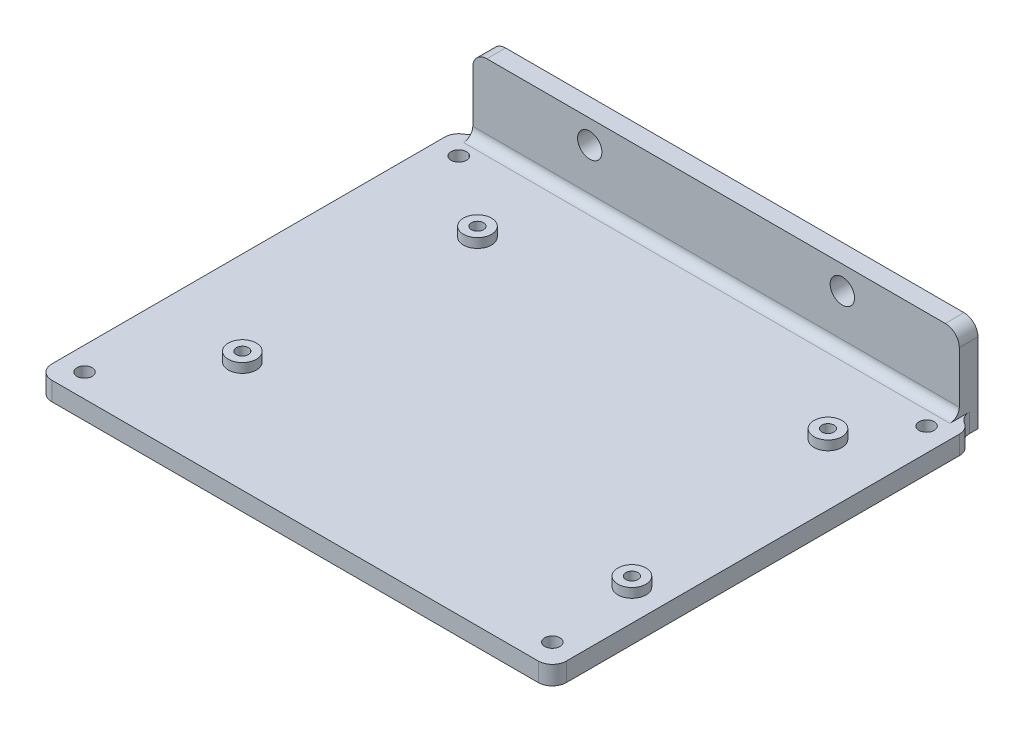
ISO-10303-21;
HEADER;
FILE_DESCRIPTION(('STEP AP214'),'2;1');
FILE_NAME('part.step','',(''),(''),'','','');
FILE_SCHEMA(('AUTOMOTIVE_DESIGN { 1 0 10303 214 1 1 1 1 }'));
ENDSEC;
DATA;
#1=APPLICATION_CONTEXT('core data for automotive mechanical design processes');
#2=APPLICATION_PROTOCOL_DEFINITION('international standard','automotive_design',2000,#1);
#3=PRODUCT_CONTEXT('',#1,'mechanical');
#4=PRODUCT('Part','Part','',(#3));
#5=PRODUCT_RELATED_PRODUCT_CATEGORY('part','',(#4));
#6=PRODUCT_DEFINITION_FORMATION('','',#4);
#7=PRODUCT_DEFINITION_CONTEXT('part definition',#1,'design');
#8=PRODUCT_DEFINITION('design','',#6,#7);
#9=PRODUCT_DEFINITION_SHAPE('','',#8);
#10=(LENGTH_UNIT() NAMED_UNIT(*) SI_UNIT(.MILLI.,.METRE.));
#11=(NAMED_UNIT(*) PLANE_ANGLE_UNIT() SI_UNIT($,.RADIAN.));
#12=(NAMED_UNIT(*) SI_UNIT($,.STERADIAN.) SOLID_ANGLE_UNIT());
#13=UNCERTAINTY_MEASURE_WITH_UNIT(LENGTH_MEASURE(1.E-05),#10,'distance_accuracy_value','');
#14=(GEOMETRIC_REPRESENTATION_CONTEXT(3) GLOBAL_UNCERTAINTY_ASSIGNED_CONTEXT((#13)) GLOBAL_UNIT_ASSIGNED_CONTEXT((#10,
#11,#12)) REPRESENTATION_CONTEXT('',''));
#15=CARTESIAN_POINT('',(0.,0.,0.));
#16=DIRECTION('',(0.,0.,1.));
#17=DIRECTION('',(1.,0.,0.));
#18=AXIS2_PLACEMENT_3D('',#15,#16,#17);
#19=CARTESIAN_POINT('',(3.,4.,-3.));
#20=DIRECTION('',(0.,-1.,0.));
#21=DIRECTION('',(0.,0.,-1.));
#22=AXIS2_PLACEMENT_3D('',#19,#20,#21);
#23=CYLINDRICAL_SURFACE('',#22,3.);
#24=CARTESIAN_POINT('',(3.,0.,-3.));
#25=DIRECTION('',(0.,1.,0.));
#26=DIRECTION('',(0.,0.,1.));
#27=AXIS2_PLACEMENT_3D('',#24,#25,#26);
#28=CIRCLE('',#27,3.);
#29=CARTESIAN_POINT('',(0.,0.,-3.00000000000002));
#30=VERTEX_POINT('',#29);
#31=CARTESIAN_POINT('',(3.00000000000002,0.,0.));
#32=VERTEX_POINT('',#31);
#33=EDGE_CURVE('E259',#30,#32,#28,.T.);
#34=ORIENTED_EDGE('',*,*,#33,.T.);
#35=DIRECTION('',(0.,-1.,0.));
#36=VECTOR('',#35,1.);
#37=CARTESIAN_POINT('',(3.00000000000002,4.,0.));
#38=LINE('',#37,#36);
#39=CARTESIAN_POINT('',(3.00000000000002,4.,0.));
#40=VERTEX_POINT('',#39);
#41=EDGE_CURVE('E328',#40,#32,#38,.T.);
#42=ORIENTED_EDGE('',*,*,#41,.F.);
#43=CARTESIAN_POINT('',(3.,4.,-3.));
#44=DIRECTION('',(0.,1.,0.));
#45=DIRECTION('',(0.,0.,1.));
#46=AXIS2_PLACEMENT_3D('',#43,#44,#45);
#47=CIRCLE('',#46,3.);
#48=CARTESIAN_POINT('',(0.,4.,-3.00000000000002));
#49=VERTEX_POINT('',#48);
#50=EDGE_CURVE('E263',#49,#40,#47,.T.);
#51=ORIENTED_EDGE('',*,*,#50,.F.);
#52=DIRECTION('',(0.,-1.,0.));
#53=VECTOR('',#52,1.);
#54=CARTESIAN_POINT('',(0.,4.,-3.00000000000002));
#55=LINE('',#54,#53);
#56=EDGE_CURVE('E287',#49,#30,#55,.T.);
#57=ORIENTED_EDGE('',*,*,#56,.T.);
#58=EDGE_LOOP('',(#34,#42,#51,#57));
#59=FACE_BOUND('',#58,.T.);
#60=ADVANCED_FACE('F39',(#59),#23,.T.);
#61=CARTESIAN_POINT('',(3.00000000000002,4.,0.));
#62=DIRECTION('',(0.,0.,-1.));
#63=DIRECTION('',(-1.,0.,0.));
#64=AXIS2_PLACEMENT_3D('',#61,#62,#63);
#65=PLANE('',#64);
#66=DIRECTION('',(1.,0.,0.));
#67=VECTOR('',#66,1.);
#68=CARTESIAN_POINT('',(3.00000000000002,0.,0.));
#69=LINE('',#68,#67);
#70=CARTESIAN_POINT('',(107.,0.,0.));
#71=VERTEX_POINT('',#70);
#72=EDGE_CURVE('E291',#32,#71,#69,.T.);
#73=ORIENTED_EDGE('',*,*,#72,.T.);
#74=DIRECTION('',(0.,-1.,0.));
#75=VECTOR('',#74,1.);
#76=CARTESIAN_POINT('',(107.,4.,0.));
#77=LINE('',#76,#75);
#78=CARTESIAN_POINT('',(107.,4.,0.));
#79=VERTEX_POINT('',#78);
#80=EDGE_CURVE('E324',#79,#71,#77,.T.);
#81=ORIENTED_EDGE('',*,*,#80,.F.);
#82=DIRECTION('',(1.,0.,0.));
#83=VECTOR('',#82,1.);
#84=CARTESIAN_POINT('',(3.00000000000002,4.,0.));
#85=LINE('',#84,#83);
#86=EDGE_CURVE('E267',#40,#79,#85,.T.);
#87=ORIENTED_EDGE('',*,*,#86,.F.);
#88=ORIENTED_EDGE('',*,*,#41,.T.);
#89=EDGE_LOOP('',(#73,#81,#87,#88));
#90=FACE_BOUND('',#89,.T.);
#91=ADVANCED_FACE('F485',(#90),#65,.F.);
#92=CARTESIAN_POINT('',(107.,4.,-3.));
#93=DIRECTION('',(0.,-1.,0.));
#94=DIRECTION('',(0.,0.,-1.));
#95=AXIS2_PLACEMENT_3D('',#92,#93,#94);
#96=CYLINDRICAL_SURFACE('',#95,3.);
#97=CARTESIAN_POINT('',(107.,0.,-3.));
#98=DIRECTION('',(0.,1.,0.));
#99=DIRECTION('',(0.,0.,1.));
#100=AXIS2_PLACEMENT_3D('',#97,#98,#99);
#101=CIRCLE('',#100,3.);
#102=CARTESIAN_POINT('',(110.,0.,-3.00000000000002));
#103=VERTEX_POINT('',#102);
#104=EDGE_CURVE('E294',#71,#103,#101,.T.);
#105=ORIENTED_EDGE('',*,*,#104,.T.);
#106=DIRECTION('',(0.,-1.,0.));
#107=VECTOR('',#106,1.);
#108=CARTESIAN_POINT('',(110.,4.,-3.00000000000002));
#109=LINE('',#108,#107);
#110=CARTESIAN_POINT('',(110.,4.,-3.00000000000002));
#111=VERTEX_POINT('',#110);
#112=EDGE_CURVE('E320',#111,#103,#109,.T.);
#113=ORIENTED_EDGE('',*,*,#112,.F.);
#114=CARTESIAN_POINT('',(107.,4.,-3.));
#115=DIRECTION('',(0.,1.,0.));
#116=DIRECTION('',(0.,0.,1.));
#117=AXIS2_PLACEMENT_3D('',#114,#115,#116);
#118=CIRCLE('',#117,3.);
#119=EDGE_CURVE('E271',#79,#111,#118,.T.);
#120=ORIENTED_EDGE('',*,*,#119,.F.);
#121=ORIENTED_EDGE('',*,*,#80,.T.);
#122=EDGE_LOOP('',(#105,#113,#120,#121));
#123=FACE_BOUND('',#122,.T.);
#124=ADVANCED_FACE('F481',(#123),#96,.T.);
#125=CARTESIAN_POINT('',(110.,4.,-3.00000000000002));
#126=DIRECTION('',(-1.,0.,0.));
#127=DIRECTION('',(0.,0.,1.));
#128=AXIS2_PLACEMENT_3D('',#125,#126,#127);
#129=PLANE('',#128);
#130=DIRECTION('',(0.,0.,-1.));
#131=VECTOR('',#130,1.);
#132=CARTESIAN_POINT('',(110.,0.,-3.00000000000002));
#133=LINE('',#132,#131);
#134=CARTESIAN_POINT('',(110.,0.,-87.));
#135=VERTEX_POINT('',#134);
#136=EDGE_CURVE('E297',#103,#135,#133,.T.);
#137=ORIENTED_EDGE('',*,*,#136,.T.);
#138=DIRECTION('',(0.,-1.,0.));
#139=VECTOR('',#138,1.);
#140=CARTESIAN_POINT('',(110.,4.,-87.));
#141=LINE('',#140,#139);
#142=CARTESIAN_POINT('',(110.,4.,-87.));
#143=VERTEX_POINT('',#142);
#144=EDGE_CURVE('E316',#143,#135,#141,.T.);
#145=ORIENTED_EDGE('',*,*,#144,.F.);
#146=DIRECTION('',(0.,0.,-1.));
#147=VECTOR('',#146,1.);
#148=CARTESIAN_POINT('',(110.,4.,-3.00000000000002));
#149=LINE('',#148,#147);
#150=EDGE_CURVE('E274',#111,#143,#149,.T.);
#151=ORIENTED_EDGE('',*,*,#150,.F.);
#152=ORIENTED_EDGE('',*,*,#112,.T.);
#153=EDGE_LOOP('',(#137,#145,#151,#152));
#154=FACE_BOUND('',#153,.T.);
#155=ADVANCED_FACE('F477',(#154),#129,.F.);
#156=CARTESIAN_POINT('',(107.,4.,-87.));
#157=DIRECTION('',(0.,-1.,0.));
#158=DIRECTION('',(0.,0.,-1.));
#159=AXIS2_PLACEMENT_3D('',#156,#157,#158);
#160=CYLINDRICAL_SURFACE('',#159,3.);
#161=CARTESIAN_POINT('',(107.,0.,-87.));
#162=DIRECTION('',(0.,1.,0.));
#163=DIRECTION('',(0.,0.,1.));
#164=AXIS2_PLACEMENT_3D('',#161,#162,#163);
#165=CIRCLE('',#164,3.);
#166=CARTESIAN_POINT('',(108.5,0.,-89.5980762113533));
#167=VERTEX_POINT('',#166);
#168=EDGE_CURVE('E300',#135,#167,#165,.T.);
#169=ORIENTED_EDGE('',*,*,#168,.T.);
#170=DIRECTION('',(0.,-1.,0.));
#171=VECTOR('',#170,1.);
#172=CARTESIAN_POINT('',(108.5,4.,-89.5980762113533));
#173=LINE('',#172,#171);
#174=CARTESIAN_POINT('',(108.5,4.,-89.5980762113533));
#175=VERTEX_POINT('',#174);
#176=EDGE_CURVE('E337',#167,#175,#173,.F.);
#177=ORIENTED_EDGE('',*,*,#176,.T.);
#178=CARTESIAN_POINT('',(107.,4.,-87.));
#179=DIRECTION('',(0.,1.,0.));
#180=DIRECTION('',(0.,0.,1.));
#181=AXIS2_PLACEMENT_3D('',#178,#179,#180);
#182=CIRCLE('',#181,3.);
#183=EDGE_CURVE('E277',#143,#175,#182,.T.);
#184=ORIENTED_EDGE('',*,*,#183,.F.);
#185=ORIENTED_EDGE('',*,*,#144,.T.);
#186=EDGE_LOOP('',(#169,#177,#184,#185));
#187=FACE_BOUND('',#186,.T.);
#188=ADVANCED_FACE('F472',(#187),#160,.T.);
#189=CARTESIAN_POINT('',(3.,4.,-87.));
#190=DIRECTION('',(0.,-1.,0.));
#191=DIRECTION('',(0.,0.,-1.));
#192=AXIS2_PLACEMENT_3D('',#189,#190,#191);
#193=CYLINDRICAL_SURFACE('',#192,3.);
#194=CARTESIAN_POINT('',(3.,4.,-87.));
#195=DIRECTION('',(0.,1.,0.));
#196=DIRECTION('',(0.,0.,1.));
#197=AXIS2_PLACEMENT_3D('',#194,#195,#196);
#198=CIRCLE('',#197,3.);
#199=CARTESIAN_POINT('',(1.5,4.,-89.5980762113533));
#200=VERTEX_POINT('',#199);
#201=CARTESIAN_POINT('',(0.,4.,-87.));
#202=VERTEX_POINT('',#201);
#203=EDGE_CURVE('E281',#200,#202,#198,.T.);
#204=ORIENTED_EDGE('',*,*,#203,.F.);
#205=DIRECTION('',(0.,-1.,0.));
#206=VECTOR('',#205,1.);
#207=CARTESIAN_POINT('',(1.5,4.,-89.5980762113533));
#208=LINE('',#207,#206);
#209=CARTESIAN_POINT('',(1.5,0.,-89.5980762113533));
#210=VERTEX_POINT('',#209);
#211=EDGE_CURVE('E340',#200,#210,#208,.T.);
#212=ORIENTED_EDGE('',*,*,#211,.T.);
#213=CARTESIAN_POINT('',(3.,0.,-87.));
#214=DIRECTION('',(0.,1.,0.));
#215=DIRECTION('',(0.,0.,1.));
#216=AXIS2_PLACEMENT_3D('',#213,#214,#215);
#217=CIRCLE('',#216,3.);
#218=CARTESIAN_POINT('',(0.,0.,-87.));
#219=VERTEX_POINT('',#218);
#220=EDGE_CURVE('E304',#210,#219,#217,.T.);
#221=ORIENTED_EDGE('',*,*,#220,.T.);
#222=DIRECTION('',(0.,-1.,0.));
#223=VECTOR('',#222,1.);
#224=CARTESIAN_POINT('',(0.,4.,-87.));
#225=LINE('',#224,#223);
#226=EDGE_CURVE('E312',#202,#219,#225,.T.);
#227=ORIENTED_EDGE('',*,*,#226,.F.);
#228=EDGE_LOOP('',(#204,#212,#221,#227));
#229=FACE_BOUND('',#228,.T.);
#230=ADVANCED_FACE('F498',(#229),#193,.T.);
#231=CARTESIAN_POINT('',(0.,4.,-3.00000000000002));
#232=DIRECTION('',(1.,0.,0.));
#233=DIRECTION('',(0.,0.,-1.));
#234=AXIS2_PLACEMENT_3D('',#231,#232,#233);
#235=PLANE('',#234);
#236=DIRECTION('',(0.,0.,1.));
#237=VECTOR('',#236,1.);
#238=CARTESIAN_POINT('',(0.,0.,-3.00000000000002));
#239=LINE('',#238,#237);
#240=EDGE_CURVE('E268',#219,#30,#239,.T.);
#241=ORIENTED_EDGE('',*,*,#240,.T.);
#242=ORIENTED_EDGE('',*,*,#56,.F.);
#243=DIRECTION('',(0.,0.,1.));
#244=VECTOR('',#243,1.);
#245=CARTESIAN_POINT('',(0.,4.,-3.00000000000002));
#246=LINE('',#245,#244);
#247=EDGE_CURVE('E284',#202,#49,#246,.T.);
#248=ORIENTED_EDGE('',*,*,#247,.F.);
#249=ORIENTED_EDGE('',*,*,#226,.T.);
#250=EDGE_LOOP('',(#241,#242,#248,#249));
#251=FACE_BOUND('',#250,.T.);
#252=ADVANCED_FACE('F493',(#251),#235,.F.);
#253=CARTESIAN_POINT('',(3.,4.,-3.));
#254=DIRECTION('',(0.,1.,0.));
#255=DIRECTION('',(0.,0.,1.));
#256=AXIS2_PLACEMENT_3D('',#253,#254,#255);
#257=PLANE('',#256);
#258=CARTESIAN_POINT('',(5.00000000000001,4.,-5.));
#259=DIRECTION('',(0.,1.,0.));
#260=DIRECTION('',(0.,0.,1.));
#261=AXIS2_PLACEMENT_3D('',#258,#259,#260);
#262=CIRCLE('',#261,1.625);
#263=CARTESIAN_POINT('',(5.00000000000001,4.,-3.375));
#264=VERTEX_POINT('',#263);
#265=EDGE_CURVE('E669',#264,#264,#262,.T.);
#266=ORIENTED_EDGE('',*,*,#265,.F.);
#267=EDGE_LOOP('',(#266));
#268=FACE_BOUND('',#267,.T.);
#269=CARTESIAN_POINT('',(105.,4.,-5.));
#270=DIRECTION('',(0.,1.,0.));
#271=DIRECTION('',(0.,0.,1.));
#272=AXIS2_PLACEMENT_3D('',#269,#270,#271);
#273=CIRCLE('',#272,1.625);
#274=CARTESIAN_POINT('',(105.,4.,-3.375));
#275=VERTEX_POINT('',#274);
#276=EDGE_CURVE('E671',#275,#275,#273,.T.);
#277=ORIENTED_EDGE('',*,*,#276,.F.);
#278=EDGE_LOOP('',(#277));
#279=FACE_BOUND('',#278,.T.);
#280=CARTESIAN_POINT('',(105.,4.,-85.));
#281=DIRECTION('',(0.,1.,0.));
#282=DIRECTION('',(0.,0.,1.));
#283=AXIS2_PLACEMENT_3D('',#280,#281,#282);
#284=CIRCLE('',#283,1.625);
#285=CARTESIAN_POINT('',(105.,4.,-83.375));
#286=VERTEX_POINT('',#285);
#287=EDGE_CURVE('E675',#286,#286,#284,.T.);
#288=ORIENTED_EDGE('',*,*,#287,.F.);
#289=EDGE_LOOP('',(#288));
#290=FACE_BOUND('',#289,.T.);
#291=CARTESIAN_POINT('',(5.,4.,-85.));
#292=DIRECTION('',(0.,1.,0.));
#293=DIRECTION('',(0.,0.,1.));
#294=AXIS2_PLACEMENT_3D('',#291,#292,#293);
#295=CIRCLE('',#294,1.625);
#296=CARTESIAN_POINT('',(5.,4.,-83.375));
#297=VERTEX_POINT('',#296);
#298=EDGE_CURVE('E376',#297,#297,#295,.T.);
#299=ORIENTED_EDGE('',*,*,#298,.F.);
#300=EDGE_LOOP('',(#299));
#301=FACE_BOUND('',#300,.T.);
#302=CARTESIAN_POINT('',(96.93,4.,-72.));
#303=DIRECTION('',(0.,1.,0.));
#304=DIRECTION('',(0.,0.,1.));
#305=AXIS2_PLACEMENT_3D('',#302,#303,#304);
#306=CIRCLE('',#305,3.00000000000001);
#307=CARTESIAN_POINT('',(96.93,4.,-69.));
#308=VERTEX_POINT('',#307);
#309=EDGE_CURVE('E227',#308,#308,#306,.T.);
#310=ORIENTED_EDGE('',*,*,#309,.F.);
#311=EDGE_LOOP('',(#310));
#312=FACE_BOUND('',#311,.T.);
#313=CARTESIAN_POINT('',(103.28,4.,-23.74));
#314=DIRECTION('',(0.,1.,0.));
#315=DIRECTION('',(0.,0.,1.));
#316=AXIS2_PLACEMENT_3D('',#313,#314,#315);
#317=CIRCLE('',#316,3.00000000000001);
#318=CARTESIAN_POINT('',(103.28,4.,-20.74));
#319=VERTEX_POINT('',#318);
#320=EDGE_CURVE('E235',#319,#319,#317,.T.);
#321=ORIENTED_EDGE('',*,*,#320,.F.);
#322=EDGE_LOOP('',(#321));
#323=FACE_BOUND('',#322,.T.);
#324=CARTESIAN_POINT('',(20.,4.,-23.74));
#325=DIRECTION('',(0.,1.,0.));
#326=DIRECTION('',(0.,0.,1.));
#327=AXIS2_PLACEMENT_3D('',#324,#325,#326);
#328=CIRCLE('',#327,3.);
#329=CARTESIAN_POINT('',(20.,4.,-20.74));
#330=VERTEX_POINT('',#329);
#331=EDGE_CURVE('E243',#330,#330,#328,.T.);
#332=ORIENTED_EDGE('',*,*,#331,.F.);
#333=EDGE_LOOP('',(#332));
#334=FACE_BOUND('',#333,.T.);
#335=CARTESIAN_POINT('',(22.,4.,-72.));
#336=DIRECTION('',(0.,1.,0.));
#337=DIRECTION('',(0.,0.,1.));
#338=AXIS2_PLACEMENT_3D('',#335,#336,#337);
#339=CIRCLE('',#338,3.);
#340=CARTESIAN_POINT('',(22.,4.,-69.));
#341=VERTEX_POINT('',#340);
#342=EDGE_CURVE('E251',#341,#341,#339,.T.);
#343=ORIENTED_EDGE('',*,*,#342,.F.);
#344=EDGE_LOOP('',(#343));
#345=FACE_BOUND('',#344,.T.);
#346=DIRECTION('',(-1.,0.,0.));
#347=VECTOR('',#346,1.);
#348=CARTESIAN_POINT('',(3.,4.,-88.));
#349=LINE('',#348,#347);
#350=CARTESIAN_POINT('',(107.,4.,-88.));
#351=VERTEX_POINT('',#350);
#352=CARTESIAN_POINT('',(3.,4.,-88.));
#353=VERTEX_POINT('',#352);
#354=EDGE_CURVE('E363',#351,#353,#349,.T.);
#355=ORIENTED_EDGE('',*,*,#354,.T.);
#356=DIRECTION('',(0.,0.,1.));
#357=VECTOR('',#356,1.);
#358=CARTESIAN_POINT('',(3.,4.,-94.));
#359=LINE('',#358,#357);
#360=CARTESIAN_POINT('',(3.,4.,-92.1961524227066));
#361=VERTEX_POINT('',#360);
#362=EDGE_CURVE('E344',#361,#353,#359,.T.);
#363=ORIENTED_EDGE('',*,*,#362,.F.);
#364=CARTESIAN_POINT('',(0.,4.,-92.1961524227066));
#365=DIRECTION('',(0.,1.,0.));
#366=DIRECTION('',(0.,0.,1.));
#367=AXIS2_PLACEMENT_3D('',#364,#365,#366);
#368=CIRCLE('',#367,3.);
#369=EDGE_CURVE('E360',#361,#200,#368,.F.);
#370=ORIENTED_EDGE('',*,*,#369,.T.);
#371=ORIENTED_EDGE('',*,*,#203,.T.);
#372=ORIENTED_EDGE('',*,*,#247,.T.);
#373=ORIENTED_EDGE('',*,*,#50,.T.);
#374=ORIENTED_EDGE('',*,*,#86,.T.);
#375=ORIENTED_EDGE('',*,*,#119,.T.);
#376=ORIENTED_EDGE('',*,*,#150,.T.);
#377=ORIENTED_EDGE('',*,*,#183,.T.);
#378=CARTESIAN_POINT('',(110.,4.,-92.1961524227066));
#379=DIRECTION('',(0.,1.,0.));
#380=DIRECTION('',(0.,0.,1.));
#381=AXIS2_PLACEMENT_3D('',#378,#379,#380);
#382=CIRCLE('',#381,3.);
#383=CARTESIAN_POINT('',(107.,4.,-92.1961524227066));
#384=VERTEX_POINT('',#383);
#385=EDGE_CURVE('E354',#175,#384,#382,.F.);
#386=ORIENTED_EDGE('',*,*,#385,.T.);
#387=DIRECTION('',(0.,0.,-1.));
#388=VECTOR('',#387,1.);
#389=CARTESIAN_POINT('',(107.,4.,-94.));
#390=LINE('',#389,#388);
#391=EDGE_CURVE('E332',#351,#384,#390,.T.);
#392=ORIENTED_EDGE('',*,*,#391,.F.);
#393=EDGE_LOOP('',(#355,#363,#370,#371,#372,#373,#374,#375,#376,#377,#386,#392));
#394=FACE_BOUND('',#393,.T.);
#395=ADVANCED_FACE('F464',(#268,#279,#290,#301,#312,#323,#334,#345,#394),#257,.T.);
#396=CARTESIAN_POINT('',(3.,0.,-3.));
#397=DIRECTION('',(0.,1.,0.));
#398=DIRECTION('',(0.,0.,1.));
#399=AXIS2_PLACEMENT_3D('',#396,#397,#398);
#400=PLANE('',#399);
#401=CARTESIAN_POINT('',(5.00000000000001,0.,-5.));
#402=DIRECTION('',(0.,1.,0.));
#403=DIRECTION('',(0.,0.,1.));
#404=AXIS2_PLACEMENT_3D('',#401,#402,#403);
#405=CIRCLE('',#404,1.625);
#406=CARTESIAN_POINT('',(5.00000000000001,0.,-3.375));
#407=VERTEX_POINT('',#406);
#408=EDGE_CURVE('E43',#407,#407,#405,.T.);
#409=ORIENTED_EDGE('',*,*,#408,.T.);
#410=EDGE_LOOP('',(#409));
#411=FACE_BOUND('',#410,.T.);
#412=CARTESIAN_POINT('',(105.,0.,-5.));
#413=DIRECTION('',(0.,1.,0.));
#414=DIRECTION('',(0.,0.,1.));
#415=AXIS2_PLACEMENT_3D('',#412,#413,#414);
#416=CIRCLE('',#415,1.625);
#417=CARTESIAN_POINT('',(105.,0.,-3.375));
#418=VERTEX_POINT('',#417);
#419=EDGE_CURVE('E379',#418,#418,#416,.T.);
#420=ORIENTED_EDGE('',*,*,#419,.T.);
#421=EDGE_LOOP('',(#420));
#422=FACE_BOUND('',#421,.T.);
#423=CARTESIAN_POINT('',(105.,0.,-85.));
#424=DIRECTION('',(0.,1.,0.));
#425=DIRECTION('',(0.,0.,1.));
#426=AXIS2_PLACEMENT_3D('',#423,#424,#425);
#427=CIRCLE('',#426,1.625);
#428=CARTESIAN_POINT('',(105.,0.,-83.375));
#429=VERTEX_POINT('',#428);
#430=EDGE_CURVE('E375',#429,#429,#427,.T.);
#431=ORIENTED_EDGE('',*,*,#430,.T.);
#432=EDGE_LOOP('',(#431));
#433=FACE_BOUND('',#432,.T.);
#434=CARTESIAN_POINT('',(5.,0.,-85.));
#435=DIRECTION('',(0.,1.,0.));
#436=DIRECTION('',(0.,0.,1.));
#437=AXIS2_PLACEMENT_3D('',#434,#435,#436);
#438=CIRCLE('',#437,1.625);
#439=CARTESIAN_POINT('',(5.,0.,-83.375));
#440=VERTEX_POINT('',#439);
#441=EDGE_CURVE('E371',#440,#440,#438,.T.);
#442=ORIENTED_EDGE('',*,*,#441,.T.);
#443=EDGE_LOOP('',(#442));
#444=FACE_BOUND('',#443,.T.);
#445=CARTESIAN_POINT('',(20.,0.,-23.74));
#446=DIRECTION('',(0.,1.,0.));
#447=DIRECTION('',(0.,0.,1.));
#448=AXIS2_PLACEMENT_3D('',#445,#446,#447);
#449=CIRCLE('',#448,1.3);
#450=CARTESIAN_POINT('',(20.,0.,-22.44));
#451=VERTEX_POINT('',#450);
#452=EDGE_CURVE('E197',#451,#451,#449,.T.);
#453=ORIENTED_EDGE('',*,*,#452,.T.);
#454=EDGE_LOOP('',(#453));
#455=FACE_BOUND('',#454,.T.);
#456=CARTESIAN_POINT('',(103.28,0.,-23.74));
#457=DIRECTION('',(0.,1.,0.));
#458=DIRECTION('',(0.,0.,1.));
#459=AXIS2_PLACEMENT_3D('',#456,#457,#458);
#460=CIRCLE('',#459,1.29999999999999);
#461=CARTESIAN_POINT('',(103.28,0.,-22.44));
#462=VERTEX_POINT('',#461);
#463=EDGE_CURVE('E212',#462,#462,#460,.T.);
#464=ORIENTED_EDGE('',*,*,#463,.T.);
#465=EDGE_LOOP('',(#464));
#466=FACE_BOUND('',#465,.T.);
#467=CARTESIAN_POINT('',(96.93,0.,-72.));
#468=DIRECTION('',(0.,1.,0.));
#469=DIRECTION('',(0.,0.,1.));
#470=AXIS2_PLACEMENT_3D('',#467,#468,#469);
#471=CIRCLE('',#470,1.29999999999999);
#472=CARTESIAN_POINT('',(96.93,0.,-70.7));
#473=VERTEX_POINT('',#472);
#474=EDGE_CURVE('E203',#473,#473,#471,.T.);
#475=ORIENTED_EDGE('',*,*,#474,.T.);
#476=EDGE_LOOP('',(#475));
#477=FACE_BOUND('',#476,.T.);
#478=CARTESIAN_POINT('',(22.,0.,-72.));
#479=DIRECTION('',(0.,1.,0.));
#480=DIRECTION('',(0.,0.,1.));
#481=AXIS2_PLACEMENT_3D('',#478,#479,#480);
#482=CIRCLE('',#481,1.29999999999999);
#483=CARTESIAN_POINT('',(22.,0.,-70.7));
#484=VERTEX_POINT('',#483);
#485=EDGE_CURVE('E223',#484,#484,#482,.T.);
#486=ORIENTED_EDGE('',*,*,#485,.T.);
#487=EDGE_LOOP('',(#486));
#488=FACE_BOUND('',#487,.T.);
#489=ORIENTED_EDGE('',*,*,#33,.F.);
#490=ORIENTED_EDGE('',*,*,#240,.F.);
#491=ORIENTED_EDGE('',*,*,#220,.F.);
#492=CARTESIAN_POINT('',(0.,0.,-92.1961524227066));
#493=DIRECTION('',(0.,1.,0.));
#494=DIRECTION('',(0.,0.,1.));
#495=AXIS2_PLACEMENT_3D('',#492,#493,#494);
#496=CIRCLE('',#495,3.);
#497=CARTESIAN_POINT('',(3.,0.,-92.1961524227066));
#498=VERTEX_POINT('',#497);
#499=EDGE_CURVE('E357',#210,#498,#496,.T.);
#500=ORIENTED_EDGE('',*,*,#499,.T.);
#501=DIRECTION('',(0.,0.,1.));
#502=VECTOR('',#501,1.);
#503=CARTESIAN_POINT('',(3.,0.,-94.));
#504=LINE('',#503,#502);
#505=CARTESIAN_POINT('',(3.,0.,-94.));
#506=VERTEX_POINT('',#505);
#507=EDGE_CURVE('E168',#506,#498,#504,.T.);
#508=ORIENTED_EDGE('',*,*,#507,.F.);
#509=DIRECTION('',(-1.,0.,0.));
#510=VECTOR('',#509,1.);
#511=CARTESIAN_POINT('',(107.,0.,-94.));
#512=LINE('',#511,#510);
#513=CARTESIAN_POINT('',(107.,0.,-94.));
#514=VERTEX_POINT('',#513);
#515=EDGE_CURVE('E161',#514,#506,#512,.T.);
#516=ORIENTED_EDGE('',*,*,#515,.F.);
#517=DIRECTION('',(0.,0.,1.));
#518=VECTOR('',#517,1.);
#519=CARTESIAN_POINT('',(107.,0.,-94.));
#520=LINE('',#519,#518);
#521=CARTESIAN_POINT('',(107.,0.,-92.1961524227066));
#522=VERTEX_POINT('',#521);
#523=EDGE_CURVE('E166',#514,#522,#520,.T.);
#524=ORIENTED_EDGE('',*,*,#523,.T.);
#525=CARTESIAN_POINT('',(110.,0.,-92.1961524227066));
#526=DIRECTION('',(0.,1.,0.));
#527=DIRECTION('',(0.,0.,1.));
#528=AXIS2_PLACEMENT_3D('',#525,#526,#527);
#529=CIRCLE('',#528,3.);
#530=EDGE_CURVE('E351',#522,#167,#529,.T.);
#531=ORIENTED_EDGE('',*,*,#530,.T.);
#532=ORIENTED_EDGE('',*,*,#168,.F.);
#533=ORIENTED_EDGE('',*,*,#136,.F.);
#534=ORIENTED_EDGE('',*,*,#104,.F.);
#535=ORIENTED_EDGE('',*,*,#72,.F.);
#536=EDGE_LOOP('',(#489,#490,#491,#500,#508,#516,#524,#531,#532,#533,#534,#535));
#537=FACE_BOUND('',#536,.T.);
#538=ADVANCED_FACE('F164',(#411,#422,#433,#444,#455,#466,#477,#488,#537),#400,.F.);
#539=CARTESIAN_POINT('',(22.,6.,-72.));
#540=DIRECTION('',(0.,-1.,0.));
#541=DIRECTION('',(0.,0.,-1.));
#542=AXIS2_PLACEMENT_3D('',#539,#540,#541);
#543=CYLINDRICAL_SURFACE('',#542,3.);
#544=CARTESIAN_POINT('',(22.,6.,-72.));
#545=DIRECTION('',(0.,1.,0.));
#546=DIRECTION('',(0.,0.,1.));
#547=AXIS2_PLACEMENT_3D('',#544,#545,#546);
#548=CIRCLE('',#547,3.);
#549=CARTESIAN_POINT('',(22.,6.,-69.));
#550=VERTEX_POINT('',#549);
#551=EDGE_CURVE('E255',#550,#550,#548,.T.);
#552=ORIENTED_EDGE('',*,*,#551,.F.);
#553=EDGE_LOOP('',(#552));
#554=FACE_BOUND('',#553,.T.);
#555=ORIENTED_EDGE('',*,*,#342,.T.);
#556=EDGE_LOOP('',(#555));
#557=FACE_BOUND('',#556,.T.);
#558=ADVANCED_FACE('F634',(#554,#557),#543,.T.);
#559=CARTESIAN_POINT('',(22.,6.,-72.));
#560=DIRECTION('',(0.,1.,0.));
#561=DIRECTION('',(0.,0.,1.));
#562=AXIS2_PLACEMENT_3D('',#559,#560,#561);
#563=PLANE('',#562);
#564=CARTESIAN_POINT('',(22.,6.,-72.));
#565=DIRECTION('',(0.,1.,0.));
#566=DIRECTION('',(0.,0.,1.));
#567=AXIS2_PLACEMENT_3D('',#564,#565,#566);
#568=CIRCLE('',#567,1.29999999999999);
#569=CARTESIAN_POINT('',(22.,6.,-70.7));
#570=VERTEX_POINT('',#569);
#571=EDGE_CURVE('E207',#570,#570,#568,.T.);
#572=ORIENTED_EDGE('',*,*,#571,.F.);
#573=EDGE_LOOP('',(#572));
#574=FACE_BOUND('',#573,.T.);
#575=ORIENTED_EDGE('',*,*,#551,.T.);
#576=EDGE_LOOP('',(#575));
#577=FACE_BOUND('',#576,.T.);
#578=ADVANCED_FACE('F695',(#574,#577),#563,.T.);
#579=CARTESIAN_POINT('',(20.,6.,-23.74));
#580=DIRECTION('',(0.,-1.,0.));
#581=DIRECTION('',(0.,0.,-1.));
#582=AXIS2_PLACEMENT_3D('',#579,#580,#581);
#583=CYLINDRICAL_SURFACE('',#582,3.);
#584=CARTESIAN_POINT('',(20.,6.,-23.74));
#585=DIRECTION('',(0.,1.,0.));
#586=DIRECTION('',(0.,0.,1.));
#587=AXIS2_PLACEMENT_3D('',#584,#585,#586);
#588=CIRCLE('',#587,3.);
#589=CARTESIAN_POINT('',(20.,6.,-20.74));
#590=VERTEX_POINT('',#589);
#591=EDGE_CURVE('E247',#590,#590,#588,.T.);
#592=ORIENTED_EDGE('',*,*,#591,.F.);
#593=EDGE_LOOP('',(#592));
#594=FACE_BOUND('',#593,.T.);
#595=ORIENTED_EDGE('',*,*,#331,.T.);
#596=EDGE_LOOP('',(#595));
#597=FACE_BOUND('',#596,.T.);
#598=ADVANCED_FACE('F701',(#594,#597),#583,.T.);
#599=CARTESIAN_POINT('',(20.,6.,-23.74));
#600=DIRECTION('',(0.,1.,0.));
#601=DIRECTION('',(0.,0.,1.));
#602=AXIS2_PLACEMENT_3D('',#599,#600,#601);
#603=PLANE('',#602);
#604=CARTESIAN_POINT('',(20.,6.,-23.74));
#605=DIRECTION('',(0.,1.,0.));
#606=DIRECTION('',(0.,0.,1.));
#607=AXIS2_PLACEMENT_3D('',#604,#605,#606);
#608=CIRCLE('',#607,1.3);
#609=CARTESIAN_POINT('',(20.,6.,-22.44));
#610=VERTEX_POINT('',#609);
#611=EDGE_CURVE('E192',#610,#610,#608,.T.);
#612=ORIENTED_EDGE('',*,*,#611,.F.);
#613=EDGE_LOOP('',(#612));
#614=FACE_BOUND('',#613,.T.);
#615=ORIENTED_EDGE('',*,*,#591,.T.);
#616=EDGE_LOOP('',(#615));
#617=FACE_BOUND('',#616,.T.);
#618=ADVANCED_FACE('F742',(#614,#617),#603,.T.);
#619=CARTESIAN_POINT('',(103.28,6.,-23.74));
#620=DIRECTION('',(0.,-1.,0.));
#621=DIRECTION('',(0.,0.,-1.));
#622=AXIS2_PLACEMENT_3D('',#619,#620,#621);
#623=CYLINDRICAL_SURFACE('',#622,3.00000000000001);
#624=CARTESIAN_POINT('',(103.28,6.,-23.74));
#625=DIRECTION('',(0.,1.,0.));
#626=DIRECTION('',(0.,0.,1.));
#627=AXIS2_PLACEMENT_3D('',#624,#625,#626);
#628=CIRCLE('',#627,3.00000000000001);
#629=CARTESIAN_POINT('',(103.28,6.,-20.74));
#630=VERTEX_POINT('',#629);
#631=EDGE_CURVE('E239',#630,#630,#628,.T.);
#632=ORIENTED_EDGE('',*,*,#631,.F.);
#633=EDGE_LOOP('',(#632));
#634=FACE_BOUND('',#633,.T.);
#635=ORIENTED_EDGE('',*,*,#320,.T.);
#636=EDGE_LOOP('',(#635));
#637=FACE_BOUND('',#636,.T.);
#638=ADVANCED_FACE('F749',(#634,#637),#623,.T.);
#639=CARTESIAN_POINT('',(103.28,6.,-23.74));
#640=DIRECTION('',(0.,1.,0.));
#641=DIRECTION('',(0.,0.,1.));
#642=AXIS2_PLACEMENT_3D('',#639,#640,#641);
#643=PLANE('',#642);
#644=CARTESIAN_POINT('',(103.28,6.,-23.74));
#645=DIRECTION('',(0.,1.,0.));
#646=DIRECTION('',(0.,0.,1.));
#647=AXIS2_PLACEMENT_3D('',#644,#645,#646);
#648=CIRCLE('',#647,1.29999999999999);
#649=CARTESIAN_POINT('',(103.28,6.,-22.44));
#650=VERTEX_POINT('',#649);
#651=EDGE_CURVE('E216',#650,#650,#648,.T.);
#652=ORIENTED_EDGE('',*,*,#651,.F.);
#653=EDGE_LOOP('',(#652));
#654=FACE_BOUND('',#653,.T.);
#655=ORIENTED_EDGE('',*,*,#631,.T.);
#656=EDGE_LOOP('',(#655));
#657=FACE_BOUND('',#656,.T.);
#658=ADVANCED_FACE('F754',(#654,#657),#643,.T.);
#659=CARTESIAN_POINT('',(96.93,6.,-72.));
#660=DIRECTION('',(0.,-1.,0.));
#661=DIRECTION('',(0.,0.,-1.));
#662=AXIS2_PLACEMENT_3D('',#659,#660,#661);
#663=CYLINDRICAL_SURFACE('',#662,3.00000000000001);
#664=CARTESIAN_POINT('',(96.93,6.,-72.));
#665=DIRECTION('',(0.,1.,0.));
#666=DIRECTION('',(0.,0.,1.));
#667=AXIS2_PLACEMENT_3D('',#664,#665,#666);
#668=CIRCLE('',#667,3.00000000000001);
#669=CARTESIAN_POINT('',(96.93,6.,-69.));
#670=VERTEX_POINT('',#669);
#671=EDGE_CURVE('E231',#670,#670,#668,.T.);
#672=ORIENTED_EDGE('',*,*,#671,.F.);
#673=EDGE_LOOP('',(#672));
#674=FACE_BOUND('',#673,.T.);
#675=ORIENTED_EDGE('',*,*,#309,.T.);
#676=EDGE_LOOP('',(#675));
#677=FACE_BOUND('',#676,.T.);
#678=ADVANCED_FACE('F762',(#674,#677),#663,.T.);
#679=CARTESIAN_POINT('',(96.93,6.,-72.));
#680=DIRECTION('',(0.,1.,0.));
#681=DIRECTION('',(0.,0.,1.));
#682=AXIS2_PLACEMENT_3D('',#679,#680,#681);
#683=PLANE('',#682);
#684=CARTESIAN_POINT('',(96.93,6.,-72.));
#685=DIRECTION('',(0.,1.,0.));
#686=DIRECTION('',(0.,0.,1.));
#687=AXIS2_PLACEMENT_3D('',#684,#685,#686);
#688=CIRCLE('',#687,1.29999999999999);
#689=CARTESIAN_POINT('',(96.93,6.,-70.7));
#690=VERTEX_POINT('',#689);
#691=EDGE_CURVE('E208',#690,#690,#688,.T.);
#692=ORIENTED_EDGE('',*,*,#691,.F.);
#693=EDGE_LOOP('',(#692));
#694=FACE_BOUND('',#693,.T.);
#695=ORIENTED_EDGE('',*,*,#671,.T.);
#696=EDGE_LOOP('',(#695));
#697=FACE_BOUND('',#696,.T.);
#698=ADVANCED_FACE('F767',(#694,#697),#683,.T.);
#699=CARTESIAN_POINT('',(96.93,0.,-72.));
#700=DIRECTION('',(0.,1.,0.));
#701=DIRECTION('',(0.,0.,1.));
#702=AXIS2_PLACEMENT_3D('',#699,#700,#701);
#703=CYLINDRICAL_SURFACE('',#702,1.29999999999999);
#704=ORIENTED_EDGE('',*,*,#474,.F.);
#705=EDGE_LOOP('',(#704));
#706=FACE_BOUND('',#705,.T.);
#707=ORIENTED_EDGE('',*,*,#691,.T.);
#708=EDGE_LOOP('',(#707));
#709=FACE_BOUND('',#708,.T.);
#710=ADVANCED_FACE('F796',(#706,#709),#703,.F.);
#711=CARTESIAN_POINT('',(103.28,0.,-23.74));
#712=DIRECTION('',(0.,1.,0.));
#713=DIRECTION('',(0.,0.,1.));
#714=AXIS2_PLACEMENT_3D('',#711,#712,#713);
#715=CYLINDRICAL_SURFACE('',#714,1.29999999999999);
#716=ORIENTED_EDGE('',*,*,#463,.F.);
#717=EDGE_LOOP('',(#716));
#718=FACE_BOUND('',#717,.T.);
#719=ORIENTED_EDGE('',*,*,#651,.T.);
#720=EDGE_LOOP('',(#719));
#721=FACE_BOUND('',#720,.T.);
#722=ADVANCED_FACE('F806',(#718,#721),#715,.F.);
#723=CARTESIAN_POINT('',(20.,0.,-23.74));
#724=DIRECTION('',(0.,1.,0.));
#725=DIRECTION('',(0.,0.,1.));
#726=AXIS2_PLACEMENT_3D('',#723,#724,#725);
#727=CYLINDRICAL_SURFACE('',#726,1.3);
#728=ORIENTED_EDGE('',*,*,#452,.F.);
#729=EDGE_LOOP('',(#728));
#730=FACE_BOUND('',#729,.T.);
#731=ORIENTED_EDGE('',*,*,#611,.T.);
#732=EDGE_LOOP('',(#731));
#733=FACE_BOUND('',#732,.T.);
#734=ADVANCED_FACE('F816',(#730,#733),#727,.F.);
#735=CARTESIAN_POINT('',(22.,0.,-72.));
#736=DIRECTION('',(0.,1.,0.));
#737=DIRECTION('',(0.,0.,1.));
#738=AXIS2_PLACEMENT_3D('',#735,#736,#737);
#739=CYLINDRICAL_SURFACE('',#738,1.29999999999999);
#740=ORIENTED_EDGE('',*,*,#485,.F.);
#741=EDGE_LOOP('',(#740));
#742=FACE_BOUND('',#741,.T.);
#743=ORIENTED_EDGE('',*,*,#571,.T.);
#744=EDGE_LOOP('',(#743));
#745=FACE_BOUND('',#744,.T.);
#746=ADVANCED_FACE('F555',(#742,#745),#739,.F.);
#747=CARTESIAN_POINT('',(104.,17.,-94.));
#748=DIRECTION('',(0.,0.,-1.));
#749=DIRECTION('',(-1.,0.,0.));
#750=AXIS2_PLACEMENT_3D('',#747,#748,#749);
#751=PLANE('',#750);
#752=CARTESIAN_POINT('',(82.,15.,-94.));
#753=DIRECTION('',(0.,0.,-1.));
#754=DIRECTION('',(-1.,0.,0.));
#755=AXIS2_PLACEMENT_3D('',#752,#753,#754);
#756=CIRCLE('',#755,2.6);
#757=CARTESIAN_POINT('',(79.4,15.,-94.));
#758=VERTEX_POINT('',#757);
#759=EDGE_CURVE('E401',#758,#758,#756,.T.);
#760=ORIENTED_EDGE('',*,*,#759,.F.);
#761=EDGE_LOOP('',(#760));
#762=FACE_BOUND('',#761,.T.);
#763=DIRECTION('',(0.,-1.,0.));
#764=VECTOR('',#763,1.);
#765=CARTESIAN_POINT('',(107.,0.,-94.));
#766=LINE('',#765,#764);
#767=CARTESIAN_POINT('',(107.,17.,-94.));
#768=VERTEX_POINT('',#767);
#769=EDGE_CURVE('E173',#768,#514,#766,.T.);
#770=ORIENTED_EDGE('',*,*,#769,.T.);
#771=ORIENTED_EDGE('',*,*,#515,.T.);
#772=DIRECTION('',(0.,1.,0.));
#773=VECTOR('',#772,1.);
#774=CARTESIAN_POINT('',(3.,0.,-94.));
#775=LINE('',#774,#773);
#776=CARTESIAN_POINT('',(3.,17.,-94.));
#777=VERTEX_POINT('',#776);
#778=EDGE_CURVE('E172',#506,#777,#775,.T.);
#779=ORIENTED_EDGE('',*,*,#778,.T.);
#780=CARTESIAN_POINT('',(6.,17.,-94.));
#781=DIRECTION('',(0.,0.,-1.));
#782=DIRECTION('',(-1.,0.,0.));
#783=AXIS2_PLACEMENT_3D('',#780,#781,#782);
#784=CIRCLE('',#783,3.);
#785=CARTESIAN_POINT('',(6.,20.,-94.));
#786=VERTEX_POINT('',#785);
#787=EDGE_CURVE('E411',#777,#786,#784,.T.);
#788=ORIENTED_EDGE('',*,*,#787,.T.);
#789=DIRECTION('',(1.,0.,0.));
#790=VECTOR('',#789,1.);
#791=CARTESIAN_POINT('',(104.,20.,-94.));
#792=LINE('',#791,#790);
#793=CARTESIAN_POINT('',(104.,20.,-94.));
#794=VERTEX_POINT('',#793);
#795=EDGE_CURVE('E414',#786,#794,#792,.T.);
#796=ORIENTED_EDGE('',*,*,#795,.T.);
#797=CARTESIAN_POINT('',(104.,17.,-94.));
#798=DIRECTION('',(0.,0.,-1.));
#799=DIRECTION('',(-1.,0.,0.));
#800=AXIS2_PLACEMENT_3D('',#797,#798,#799);
#801=CIRCLE('',#800,3.);
#802=EDGE_CURVE('E179',#794,#768,#801,.T.);
#803=ORIENTED_EDGE('',*,*,#802,.T.);
#804=EDGE_LOOP('',(#770,#771,#779,#788,#796,#803));
#805=FACE_BOUND('',#804,.T.);
#806=CARTESIAN_POINT('',(28.,15.,-94.));
#807=DIRECTION('',(0.,0.,-1.));
#808=DIRECTION('',(-1.,0.,0.));
#809=AXIS2_PLACEMENT_3D('',#806,#807,#808);
#810=CIRCLE('',#809,2.6);
#811=CARTESIAN_POINT('',(25.4,15.,-94.));
#812=VERTEX_POINT('',#811);
#813=EDGE_CURVE('E391',#812,#812,#810,.T.);
#814=ORIENTED_EDGE('',*,*,#813,.F.);
#815=EDGE_LOOP('',(#814));
#816=FACE_BOUND('',#815,.T.);
#817=ADVANCED_FACE('F176',(#762,#805,#816),#751,.T.);
#818=CARTESIAN_POINT('',(104.,17.,-90.));
#819=DIRECTION('',(0.,0.,-1.));
#820=DIRECTION('',(-1.,0.,0.));
#821=AXIS2_PLACEMENT_3D('',#818,#819,#820);
#822=PLANE('',#821);
#823=DIRECTION('',(0.,1.,0.));
#824=VECTOR('',#823,1.);
#825=CARTESIAN_POINT('',(3.,0.,-90.));
#826=LINE('',#825,#824);
#827=CARTESIAN_POINT('',(3.,6.,-90.));
#828=VERTEX_POINT('',#827);
#829=CARTESIAN_POINT('',(3.,17.,-90.));
#830=VERTEX_POINT('',#829);
#831=EDGE_CURVE('E422',#828,#830,#826,.T.);
#832=ORIENTED_EDGE('',*,*,#831,.F.);
#833=DIRECTION('',(-1.,0.,0.));
#834=VECTOR('',#833,1.);
#835=CARTESIAN_POINT('',(104.,6.,-90.));
#836=LINE('',#835,#834);
#837=CARTESIAN_POINT('',(107.,6.,-90.));
#838=VERTEX_POINT('',#837);
#839=EDGE_CURVE('E63',#828,#838,#836,.F.);
#840=ORIENTED_EDGE('',*,*,#839,.T.);
#841=DIRECTION('',(0.,-1.,0.));
#842=VECTOR('',#841,1.);
#843=CARTESIAN_POINT('',(107.,0.,-90.));
#844=LINE('',#843,#842);
#845=CARTESIAN_POINT('',(107.,17.,-90.));
#846=VERTEX_POINT('',#845);
#847=EDGE_CURVE('E405',#846,#838,#844,.T.);
#848=ORIENTED_EDGE('',*,*,#847,.F.);
#849=CARTESIAN_POINT('',(104.,17.,-90.));
#850=DIRECTION('',(0.,0.,-1.));
#851=DIRECTION('',(-1.,0.,0.));
#852=AXIS2_PLACEMENT_3D('',#849,#850,#851);
#853=CIRCLE('',#852,3.);
#854=CARTESIAN_POINT('',(104.,20.,-90.));
#855=VERTEX_POINT('',#854);
#856=EDGE_CURVE('E184',#855,#846,#853,.T.);
#857=ORIENTED_EDGE('',*,*,#856,.F.);
#858=DIRECTION('',(1.,0.,0.));
#859=VECTOR('',#858,1.);
#860=CARTESIAN_POINT('',(104.,20.,-90.));
#861=LINE('',#860,#859);
#862=CARTESIAN_POINT('',(6.,20.,-90.));
#863=VERTEX_POINT('',#862);
#864=EDGE_CURVE('E428',#863,#855,#861,.T.);
#865=ORIENTED_EDGE('',*,*,#864,.F.);
#866=CARTESIAN_POINT('',(6.,17.,-90.));
#867=DIRECTION('',(0.,0.,-1.));
#868=DIRECTION('',(-1.,0.,0.));
#869=AXIS2_PLACEMENT_3D('',#866,#867,#868);
#870=CIRCLE('',#869,3.);
#871=EDGE_CURVE('E425',#830,#863,#870,.T.);
#872=ORIENTED_EDGE('',*,*,#871,.F.);
#873=EDGE_LOOP('',(#832,#840,#848,#857,#865,#872));
#874=FACE_BOUND('',#873,.T.);
#875=CARTESIAN_POINT('',(82.,15.,-90.));
#876=DIRECTION('',(0.,0.,-1.));
#877=DIRECTION('',(-1.,0.,0.));
#878=AXIS2_PLACEMENT_3D('',#875,#876,#877);
#879=CIRCLE('',#878,2.6);
#880=CARTESIAN_POINT('',(79.4,15.,-90.));
#881=VERTEX_POINT('',#880);
#882=EDGE_CURVE('E397',#881,#881,#879,.T.);
#883=ORIENTED_EDGE('',*,*,#882,.T.);
#884=EDGE_LOOP('',(#883));
#885=FACE_BOUND('',#884,.T.);
#886=CARTESIAN_POINT('',(28.,15.,-90.));
#887=DIRECTION('',(0.,0.,-1.));
#888=DIRECTION('',(-1.,0.,0.));
#889=AXIS2_PLACEMENT_3D('',#886,#887,#888);
#890=CIRCLE('',#889,2.6);
#891=CARTESIAN_POINT('',(25.4,15.,-90.));
#892=VERTEX_POINT('',#891);
#893=EDGE_CURVE('E386',#892,#892,#890,.T.);
#894=ORIENTED_EDGE('',*,*,#893,.T.);
#895=EDGE_LOOP('',(#894));
#896=FACE_BOUND('',#895,.T.);
#897=ADVANCED_FACE('F451',(#874,#885,#896),#822,.F.);
#898=CARTESIAN_POINT('',(107.,0.,-94.));
#899=DIRECTION('',(-1.,0.,0.));
#900=DIRECTION('',(0.,0.,1.));
#901=AXIS2_PLACEMENT_3D('',#898,#899,#900);
#902=PLANE('',#901);
#903=ORIENTED_EDGE('',*,*,#391,.T.);
#904=DIRECTION('',(0.,1.,0.));
#905=VECTOR('',#904,1.);
#906=CARTESIAN_POINT('',(107.,0.,-92.1961524227066));
#907=LINE('',#906,#905);
#908=EDGE_CURVE('E190',#384,#522,#907,.F.);
#909=ORIENTED_EDGE('',*,*,#908,.T.);
#910=ORIENTED_EDGE('',*,*,#523,.F.);
#911=ORIENTED_EDGE('',*,*,#769,.F.);
#912=DIRECTION('',(0.,0.,1.));
#913=VECTOR('',#912,1.);
#914=CARTESIAN_POINT('',(107.,17.,-94.));
#915=LINE('',#914,#913);
#916=EDGE_CURVE('E419',#768,#846,#915,.T.);
#917=ORIENTED_EDGE('',*,*,#916,.T.);
#918=ORIENTED_EDGE('',*,*,#847,.T.);
#919=CARTESIAN_POINT('',(107.,6.,-88.));
#920=DIRECTION('',(-1.,0.,0.));
#921=DIRECTION('',(0.,0.,1.));
#922=AXIS2_PLACEMENT_3D('',#919,#920,#921);
#923=CIRCLE('',#922,2.);
#924=EDGE_CURVE('E11',#838,#351,#923,.T.);
#925=ORIENTED_EDGE('',*,*,#924,.T.);
#926=EDGE_LOOP('',(#903,#909,#910,#911,#917,#918,#925));
#927=FACE_BOUND('',#926,.T.);
#928=ADVANCED_FACE('F188',(#927),#902,.F.);
#929=CARTESIAN_POINT('',(3.,0.,-94.));
#930=DIRECTION('',(1.,0.,0.));
#931=DIRECTION('',(0.,1.,0.));
#932=AXIS2_PLACEMENT_3D('',#929,#930,#931);
#933=PLANE('',#932);
#934=ORIENTED_EDGE('',*,*,#507,.T.);
#935=DIRECTION('',(0.,1.,0.));
#936=VECTOR('',#935,1.);
#937=CARTESIAN_POINT('',(3.,4.,-92.1961524227066));
#938=LINE('',#937,#936);
#939=EDGE_CURVE('E347',#498,#361,#938,.T.);
#940=ORIENTED_EDGE('',*,*,#939,.T.);
#941=ORIENTED_EDGE('',*,*,#362,.T.);
#942=CARTESIAN_POINT('',(3.,6.,-88.));
#943=DIRECTION('',(1.,0.,0.));
#944=DIRECTION('',(0.,1.,0.));
#945=AXIS2_PLACEMENT_3D('',#942,#943,#944);
#946=CIRCLE('',#945,2.);
#947=EDGE_CURVE('E49',#353,#828,#946,.T.);
#948=ORIENTED_EDGE('',*,*,#947,.T.);
#949=ORIENTED_EDGE('',*,*,#831,.T.);
#950=DIRECTION('',(0.,0.,1.));
#951=VECTOR('',#950,1.);
#952=CARTESIAN_POINT('',(3.,17.,-94.));
#953=LINE('',#952,#951);
#954=EDGE_CURVE('E199',#777,#830,#953,.T.);
#955=ORIENTED_EDGE('',*,*,#954,.F.);
#956=ORIENTED_EDGE('',*,*,#778,.F.);
#957=EDGE_LOOP('',(#934,#940,#941,#948,#949,#955,#956));
#958=FACE_BOUND('',#957,.T.);
#959=ADVANCED_FACE('F504',(#958),#933,.F.);
#960=CARTESIAN_POINT('',(6.,17.,-94.));
#961=DIRECTION('',(0.,0.,1.));
#962=DIRECTION('',(1.,0.,0.));
#963=AXIS2_PLACEMENT_3D('',#960,#961,#962);
#964=CYLINDRICAL_SURFACE('',#963,3.);
#965=ORIENTED_EDGE('',*,*,#871,.T.);
#966=DIRECTION('',(0.,0.,1.));
#967=VECTOR('',#966,1.);
#968=CARTESIAN_POINT('',(6.,20.,-94.));
#969=LINE('',#968,#967);
#970=EDGE_CURVE('E439',#786,#863,#969,.T.);
#971=ORIENTED_EDGE('',*,*,#970,.F.);
#972=ORIENTED_EDGE('',*,*,#787,.F.);
#973=ORIENTED_EDGE('',*,*,#954,.T.);
#974=EDGE_LOOP('',(#965,#971,#972,#973));
#975=FACE_BOUND('',#974,.T.);
#976=ADVANCED_FACE('F448',(#975),#964,.T.);
#977=CARTESIAN_POINT('',(104.,20.,-94.));
#978=DIRECTION('',(0.,-1.,0.));
#979=DIRECTION('',(0.,0.,-1.));
#980=AXIS2_PLACEMENT_3D('',#977,#978,#979);
#981=PLANE('',#980);
#982=ORIENTED_EDGE('',*,*,#864,.T.);
#983=DIRECTION('',(0.,0.,1.));
#984=VECTOR('',#983,1.);
#985=CARTESIAN_POINT('',(104.,20.,-94.));
#986=LINE('',#985,#984);
#987=EDGE_CURVE('E435',#794,#855,#986,.T.);
#988=ORIENTED_EDGE('',*,*,#987,.F.);
#989=ORIENTED_EDGE('',*,*,#795,.F.);
#990=ORIENTED_EDGE('',*,*,#970,.T.);
#991=EDGE_LOOP('',(#982,#988,#989,#990));
#992=FACE_BOUND('',#991,.T.);
#993=ADVANCED_FACE('F456',(#992),#981,.F.);
#994=CARTESIAN_POINT('',(104.,17.,-94.));
#995=DIRECTION('',(0.,0.,1.));
#996=DIRECTION('',(1.,0.,0.));
#997=AXIS2_PLACEMENT_3D('',#994,#995,#996);
#998=CYLINDRICAL_SURFACE('',#997,3.);
#999=ORIENTED_EDGE('',*,*,#856,.T.);
#1000=ORIENTED_EDGE('',*,*,#916,.F.);
#1001=ORIENTED_EDGE('',*,*,#802,.F.);
#1002=ORIENTED_EDGE('',*,*,#987,.T.);
#1003=EDGE_LOOP('',(#999,#1000,#1001,#1002));
#1004=FACE_BOUND('',#1003,.T.);
#1005=ADVANCED_FACE('F459',(#1004),#998,.T.);
#1006=CARTESIAN_POINT('',(82.,15.,-94.));
#1007=DIRECTION('',(0.,0.,1.));
#1008=DIRECTION('',(1.,0.,0.));
#1009=AXIS2_PLACEMENT_3D('',#1006,#1007,#1008);
#1010=CYLINDRICAL_SURFACE('',#1009,2.6);
#1011=ORIENTED_EDGE('',*,*,#759,.T.);
#1012=EDGE_LOOP('',(#1011));
#1013=FACE_BOUND('',#1012,.T.);
#1014=ORIENTED_EDGE('',*,*,#882,.F.);
#1015=EDGE_LOOP('',(#1014));
#1016=FACE_BOUND('',#1015,.T.);
#1017=ADVANCED_FACE('F548',(#1013,#1016),#1010,.F.);
#1018=CARTESIAN_POINT('',(28.,15.,-94.));
#1019=DIRECTION('',(0.,0.,1.));
#1020=DIRECTION('',(1.,0.,0.));
#1021=AXIS2_PLACEMENT_3D('',#1018,#1019,#1020);
#1022=CYLINDRICAL_SURFACE('',#1021,2.6);
#1023=ORIENTED_EDGE('',*,*,#813,.T.);
#1024=EDGE_LOOP('',(#1023));
#1025=FACE_BOUND('',#1024,.T.);
#1026=ORIENTED_EDGE('',*,*,#893,.F.);
#1027=EDGE_LOOP('',(#1026));
#1028=FACE_BOUND('',#1027,.T.);
#1029=ADVANCED_FACE('F522',(#1025,#1028),#1022,.F.);
#1030=CARTESIAN_POINT('',(110.,4.,-92.1961524227066));
#1031=DIRECTION('',(0.,-1.,0.));
#1032=DIRECTION('',(0.,0.,-1.));
#1033=AXIS2_PLACEMENT_3D('',#1030,#1031,#1032);
#1034=CYLINDRICAL_SURFACE('',#1033,3.);
#1035=ORIENTED_EDGE('',*,*,#385,.F.);
#1036=ORIENTED_EDGE('',*,*,#176,.F.);
#1037=ORIENTED_EDGE('',*,*,#530,.F.);
#1038=ORIENTED_EDGE('',*,*,#908,.F.);
#1039=EDGE_LOOP('',(#1035,#1036,#1037,#1038));
#1040=FACE_BOUND('',#1039,.T.);
#1041=ADVANCED_FACE('F467',(#1040),#1034,.F.);
#1042=CARTESIAN_POINT('',(0.,4.,-92.1961524227066));
#1043=DIRECTION('',(0.,-1.,0.));
#1044=DIRECTION('',(0.,0.,-1.));
#1045=AXIS2_PLACEMENT_3D('',#1042,#1043,#1044);
#1046=CYLINDRICAL_SURFACE('',#1045,3.);
#1047=ORIENTED_EDGE('',*,*,#369,.F.);
#1048=ORIENTED_EDGE('',*,*,#939,.F.);
#1049=ORIENTED_EDGE('',*,*,#499,.F.);
#1050=ORIENTED_EDGE('',*,*,#211,.F.);
#1051=EDGE_LOOP('',(#1047,#1048,#1049,#1050));
#1052=FACE_BOUND('',#1051,.T.);
#1053=ADVANCED_FACE('F502',(#1052),#1046,.F.);
#1054=CARTESIAN_POINT('',(3.,6.,-88.));
#1055=DIRECTION('',(-1.,0.,0.));
#1056=DIRECTION('',(0.,0.,1.));
#1057=AXIS2_PLACEMENT_3D('',#1054,#1055,#1056);
#1058=CYLINDRICAL_SURFACE('',#1057,2.);
#1059=ORIENTED_EDGE('',*,*,#924,.F.);
#1060=ORIENTED_EDGE('',*,*,#839,.F.);
#1061=ORIENTED_EDGE('',*,*,#947,.F.);
#1062=ORIENTED_EDGE('',*,*,#354,.F.);
#1063=EDGE_LOOP('',(#1059,#1060,#1061,#1062));
#1064=FACE_BOUND('',#1063,.T.);
#1065=ADVANCED_FACE('F41',(#1064),#1058,.F.);
#1066=CARTESIAN_POINT('',(5.,-6.,-85.));
#1067=DIRECTION('',(0.,1.,0.));
#1068=DIRECTION('',(0.,0.,1.));
#1069=AXIS2_PLACEMENT_3D('',#1066,#1067,#1068);
#1070=CYLINDRICAL_SURFACE('',#1069,1.625);
#1071=ORIENTED_EDGE('',*,*,#298,.T.);
#1072=EDGE_LOOP('',(#1071));
#1073=FACE_BOUND('',#1072,.T.);
#1074=ORIENTED_EDGE('',*,*,#441,.F.);
#1075=EDGE_LOOP('',(#1074));
#1076=FACE_BOUND('',#1075,.T.);
#1077=ADVANCED_FACE('F527',(#1073,#1076),#1070,.F.);
#1078=CARTESIAN_POINT('',(105.,-6.,-85.));
#1079=DIRECTION('',(0.,1.,0.));
#1080=DIRECTION('',(0.,0.,1.));
#1081=AXIS2_PLACEMENT_3D('',#1078,#1079,#1080);
#1082=CYLINDRICAL_SURFACE('',#1081,1.625);
#1083=ORIENTED_EDGE('',*,*,#287,.T.);
#1084=EDGE_LOOP('',(#1083));
#1085=FACE_BOUND('',#1084,.T.);
#1086=ORIENTED_EDGE('',*,*,#430,.F.);
#1087=EDGE_LOOP('',(#1086));
#1088=FACE_BOUND('',#1087,.T.);
#1089=ADVANCED_FACE('F531',(#1085,#1088),#1082,.F.);
#1090=CARTESIAN_POINT('',(105.,-6.,-5.));
#1091=DIRECTION('',(0.,1.,0.));
#1092=DIRECTION('',(0.,0.,1.));
#1093=AXIS2_PLACEMENT_3D('',#1090,#1091,#1092);
#1094=CYLINDRICAL_SURFACE('',#1093,1.625);
#1095=ORIENTED_EDGE('',*,*,#276,.T.);
#1096=EDGE_LOOP('',(#1095));
#1097=FACE_BOUND('',#1096,.T.);
#1098=ORIENTED_EDGE('',*,*,#419,.F.);
#1099=EDGE_LOOP('',(#1098));
#1100=FACE_BOUND('',#1099,.T.);
#1101=ADVANCED_FACE('F537',(#1097,#1100),#1094,.F.);
#1102=CARTESIAN_POINT('',(5.00000000000001,-6.,-5.));
#1103=DIRECTION('',(0.,1.,0.));
#1104=DIRECTION('',(0.,0.,1.));
#1105=AXIS2_PLACEMENT_3D('',#1102,#1103,#1104);
#1106=CYLINDRICAL_SURFACE('',#1105,1.625);
#1107=ORIENTED_EDGE('',*,*,#265,.T.);
#1108=EDGE_LOOP('',(#1107));
#1109=FACE_BOUND('',#1108,.T.);
#1110=ORIENTED_EDGE('',*,*,#408,.F.);
#1111=EDGE_LOOP('',(#1110));
#1112=FACE_BOUND('',#1111,.T.);
#1113=ADVANCED_FACE('F544',(#1109,#1112),#1106,.F.);
#1114=CLOSED_SHELL('',(#60,#91,#124,#155,#188,#230,#252,#395,#538,#558,#578,#598,#618,#638,#658,
#678,#698,#710,#722,#734,#746,#817,#897,#928,#959,#976,#993,#1005,#1017,#1029,#1041,#1053,#1065,
#1077,#1089,#1101,#1113));
#1115=MANIFOLD_SOLID_BREP('B2',#1114);
#1116=ADVANCED_BREP_SHAPE_REPRESENTATION('',(#18,#1115),#14);
#1117=SHAPE_DEFINITION_REPRESENTATION(#9,#1116);
ENDSEC;
END-ISO-10303-21;
